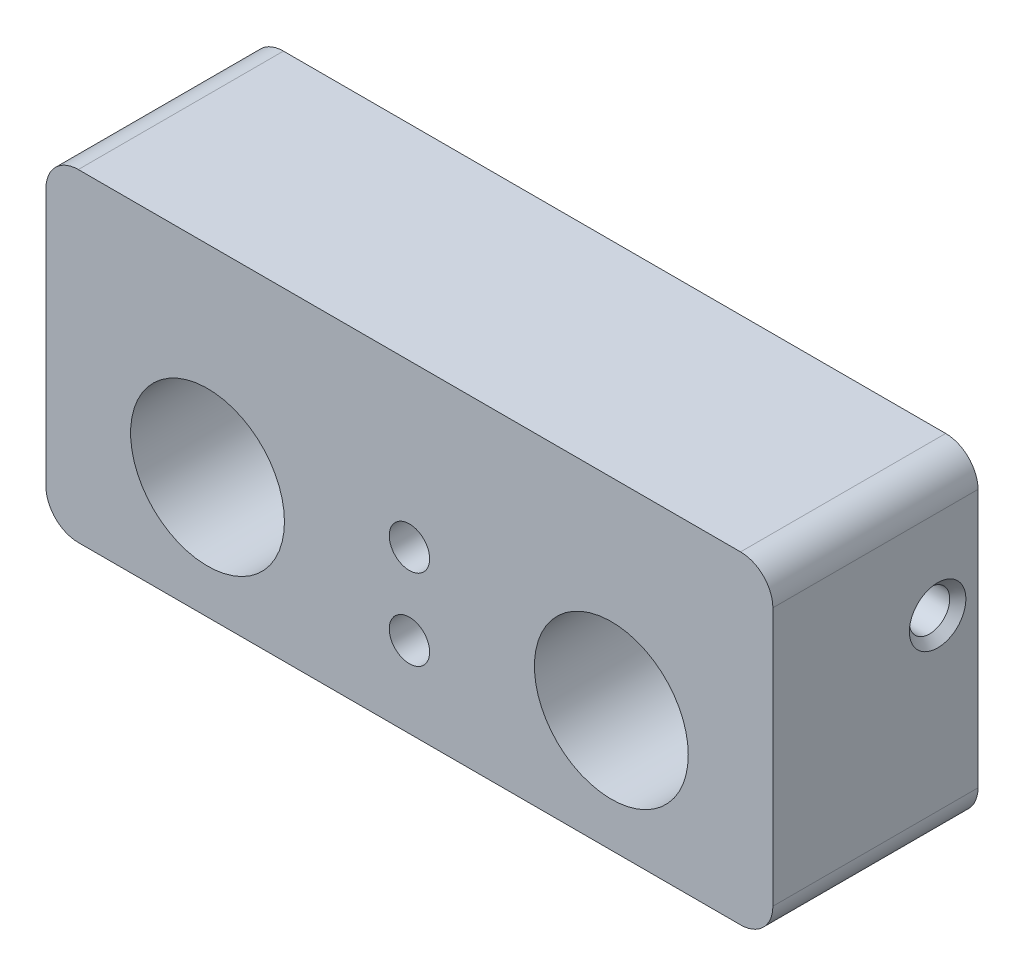
ISO-10303-21;
HEADER;
FILE_DESCRIPTION(('STEP AP214'),'2;1');
FILE_NAME('part.step','',(''),(''),'','','');
FILE_SCHEMA(('AUTOMOTIVE_DESIGN { 1 0 10303 214 1 1 1 1 }'));
ENDSEC;
DATA;
#1=APPLICATION_CONTEXT('core data for automotive mechanical design processes');
#2=APPLICATION_PROTOCOL_DEFINITION('international standard','automotive_design',2000,#1);
#3=PRODUCT_CONTEXT('',#1,'mechanical');
#4=PRODUCT('Part','Part','',(#3));
#5=PRODUCT_RELATED_PRODUCT_CATEGORY('part','',(#4));
#6=PRODUCT_DEFINITION_FORMATION('','',#4);
#7=PRODUCT_DEFINITION_CONTEXT('part definition',#1,'design');
#8=PRODUCT_DEFINITION('design','',#6,#7);
#9=PRODUCT_DEFINITION_SHAPE('','',#8);
#10=(LENGTH_UNIT() NAMED_UNIT(*) SI_UNIT(.MILLI.,.METRE.));
#11=(NAMED_UNIT(*) PLANE_ANGLE_UNIT() SI_UNIT($,.RADIAN.));
#12=(NAMED_UNIT(*) SI_UNIT($,.STERADIAN.) SOLID_ANGLE_UNIT());
#13=UNCERTAINTY_MEASURE_WITH_UNIT(LENGTH_MEASURE(1.E-05),#10,'distance_accuracy_value','');
#14=(GEOMETRIC_REPRESENTATION_CONTEXT(3) GLOBAL_UNCERTAINTY_ASSIGNED_CONTEXT((#13)) GLOBAL_UNIT_ASSIGNED_CONTEXT((#10,
#11,#12)) REPRESENTATION_CONTEXT('',''));
#15=CARTESIAN_POINT('',(0.,0.,0.));
#16=DIRECTION('',(0.,0.,1.));
#17=DIRECTION('',(1.,0.,0.));
#18=AXIS2_PLACEMENT_3D('',#15,#16,#17);
#19=CARTESIAN_POINT('',(0.,0.,12.7));
#20=DIRECTION('',(0.,0.,1.));
#21=DIRECTION('',(1.,0.,0.));
#22=AXIS2_PLACEMENT_3D('',#19,#20,#21);
#23=PLANE('',#22);
#24=CARTESIAN_POINT('',(5.81896551724137,-6.28448275862069,12.7));
#25=DIRECTION('',(0.,0.,1.));
#26=DIRECTION('',(1.,0.,0.));
#27=AXIS2_PLACEMENT_3D('',#24,#25,#26);
#28=CIRCLE('',#27,1.25);
#29=CARTESIAN_POINT('',(7.06896551724137,-6.28448275862069,12.7));
#30=VERTEX_POINT('',#29);
#31=EDGE_CURVE('E126',#30,#30,#28,.T.);
#32=ORIENTED_EDGE('',*,*,#31,.F.);
#33=EDGE_LOOP('',(#32));
#34=FACE_BOUND('',#33,.T.);
#35=CARTESIAN_POINT('',(5.81896551724137,-11.2844827586207,12.7));
#36=DIRECTION('',(0.,0.,1.));
#37=DIRECTION('',(1.,0.,0.));
#38=AXIS2_PLACEMENT_3D('',#35,#36,#37);
#39=CIRCLE('',#38,1.25);
#40=CARTESIAN_POINT('',(7.06896551724137,-11.2844827586207,12.7));
#41=VERTEX_POINT('',#40);
#42=EDGE_CURVE('E134',#41,#41,#39,.T.);
#43=ORIENTED_EDGE('',*,*,#42,.F.);
#44=EDGE_LOOP('',(#43));
#45=FACE_BOUND('',#44,.T.);
#46=CARTESIAN_POINT('',(-6.68103448275862,-8.78448275862069,12.7));
#47=DIRECTION('',(0.,0.,1.));
#48=DIRECTION('',(1.,0.,0.));
#49=AXIS2_PLACEMENT_3D('',#46,#47,#48);
#50=CIRCLE('',#49,4.7625);
#51=CARTESIAN_POINT('',(-1.91853448275862,-8.78448275862069,12.7));
#52=VERTEX_POINT('',#51);
#53=EDGE_CURVE('E147',#52,#52,#50,.T.);
#54=ORIENTED_EDGE('',*,*,#53,.F.);
#55=EDGE_LOOP('',(#54));
#56=FACE_BOUND('',#55,.T.);
#57=DIRECTION('',(1.,0.,0.));
#58=VECTOR('',#57,1.);
#59=CARTESIAN_POINT('',(-16.6810344827586,-16.2844827586207,12.7));
#60=LINE('',#59,#58);
#61=CARTESIAN_POINT('',(-14.6810344827586,-16.2844827586207,12.7));
#62=VERTEX_POINT('',#61);
#63=CARTESIAN_POINT('',(26.3189655172414,-16.2844827586207,12.7));
#64=VERTEX_POINT('',#63);
#65=EDGE_CURVE('E156',#62,#64,#60,.T.);
#66=ORIENTED_EDGE('',*,*,#65,.T.);
#67=CARTESIAN_POINT('',(26.3189655172414,-14.2844827586207,12.7));
#68=DIRECTION('',(0.,0.,1.));
#69=DIRECTION('',(1.,0.,0.));
#70=AXIS2_PLACEMENT_3D('',#67,#68,#69);
#71=CIRCLE('',#70,2.);
#72=CARTESIAN_POINT('',(28.3189655172414,-14.2844827586207,12.7));
#73=VERTEX_POINT('',#72);
#74=EDGE_CURVE('E196',#64,#73,#71,.T.);
#75=ORIENTED_EDGE('',*,*,#74,.T.);
#76=DIRECTION('',(0.,1.,0.));
#77=VECTOR('',#76,1.);
#78=CARTESIAN_POINT('',(28.3189655172414,3.71551724137931,12.7));
#79=LINE('',#78,#77);
#80=CARTESIAN_POINT('',(28.3189655172414,1.71551724137931,12.7));
#81=VERTEX_POINT('',#80);
#82=EDGE_CURVE('E160',#73,#81,#79,.T.);
#83=ORIENTED_EDGE('',*,*,#82,.T.);
#84=CARTESIAN_POINT('',(26.3189655172414,1.71551724137931,12.7));
#85=DIRECTION('',(0.,0.,1.));
#86=DIRECTION('',(1.,0.,0.));
#87=AXIS2_PLACEMENT_3D('',#84,#85,#86);
#88=CIRCLE('',#87,2.);
#89=CARTESIAN_POINT('',(26.3189655172414,3.71551724137931,12.7));
#90=VERTEX_POINT('',#89);
#91=EDGE_CURVE('E58',#81,#90,#88,.T.);
#92=ORIENTED_EDGE('',*,*,#91,.T.);
#93=DIRECTION('',(-1.,0.,0.));
#94=VECTOR('',#93,1.);
#95=CARTESIAN_POINT('',(-16.6810344827586,3.71551724137931,12.7));
#96=LINE('',#95,#94);
#97=CARTESIAN_POINT('',(-14.6810344827586,3.71551724137931,12.7));
#98=VERTEX_POINT('',#97);
#99=EDGE_CURVE('E162',#90,#98,#96,.T.);
#100=ORIENTED_EDGE('',*,*,#99,.T.);
#101=CARTESIAN_POINT('',(-14.6810344827586,1.71551724137931,12.7));
#102=DIRECTION('',(0.,0.,1.));
#103=DIRECTION('',(1.,0.,0.));
#104=AXIS2_PLACEMENT_3D('',#101,#102,#103);
#105=CIRCLE('',#104,2.);
#106=CARTESIAN_POINT('',(-16.6810344827586,1.71551724137931,12.7));
#107=VERTEX_POINT('',#106);
#108=EDGE_CURVE('E193',#98,#107,#105,.T.);
#109=ORIENTED_EDGE('',*,*,#108,.T.);
#110=DIRECTION('',(0.,-1.,0.));
#111=VECTOR('',#110,1.);
#112=CARTESIAN_POINT('',(-16.6810344827586,3.71551724137931,12.7));
#113=LINE('',#112,#111);
#114=CARTESIAN_POINT('',(-16.6810344827586,-14.2844827586207,12.7));
#115=VERTEX_POINT('',#114);
#116=EDGE_CURVE('E153',#107,#115,#113,.T.);
#117=ORIENTED_EDGE('',*,*,#116,.T.);
#118=CARTESIAN_POINT('',(-14.6810344827586,-14.2844827586207,12.7));
#119=DIRECTION('',(0.,0.,1.));
#120=DIRECTION('',(1.,0.,0.));
#121=AXIS2_PLACEMENT_3D('',#118,#119,#120);
#122=CIRCLE('',#121,2.);
#123=EDGE_CURVE('E191',#115,#62,#122,.T.);
#124=ORIENTED_EDGE('',*,*,#123,.T.);
#125=EDGE_LOOP('',(#66,#75,#83,#92,#100,#109,#117,#124));
#126=FACE_BOUND('',#125,.T.);
#127=CARTESIAN_POINT('',(18.3189655172414,-8.78448275862069,12.7));
#128=DIRECTION('',(0.,0.,1.));
#129=DIRECTION('',(1.,0.,0.));
#130=AXIS2_PLACEMENT_3D('',#127,#128,#129);
#131=CIRCLE('',#130,4.7625);
#132=CARTESIAN_POINT('',(23.0814655172414,-8.78448275862069,12.7));
#133=VERTEX_POINT('',#132);
#134=EDGE_CURVE('E141',#133,#133,#131,.T.);
#135=ORIENTED_EDGE('',*,*,#134,.F.);
#136=EDGE_LOOP('',(#135));
#137=FACE_BOUND('',#136,.T.);
#138=ADVANCED_FACE('F35',(#34,#45,#56,#126,#137),#23,.T.);
#139=CARTESIAN_POINT('',(0.,0.,0.));
#140=DIRECTION('',(0.,0.,1.));
#141=DIRECTION('',(1.,0.,0.));
#142=AXIS2_PLACEMENT_3D('',#139,#140,#141);
#143=PLANE('',#142);
#144=DIRECTION('',(0.,1.,0.));
#145=VECTOR('',#144,1.);
#146=CARTESIAN_POINT('',(28.3189655172414,3.71551724137931,0.));
#147=LINE('',#146,#145);
#148=CARTESIAN_POINT('',(28.3189655172414,-14.2844827586207,0.));
#149=VERTEX_POINT('',#148);
#150=CARTESIAN_POINT('',(28.3189655172414,1.71551724137931,0.));
#151=VERTEX_POINT('',#150);
#152=EDGE_CURVE('E170',#149,#151,#147,.T.);
#153=ORIENTED_EDGE('',*,*,#152,.F.);
#154=CARTESIAN_POINT('',(26.3189655172414,-14.2844827586207,0.));
#155=DIRECTION('',(0.,0.,1.));
#156=DIRECTION('',(1.,0.,0.));
#157=AXIS2_PLACEMENT_3D('',#154,#155,#156);
#158=CIRCLE('',#157,2.);
#159=CARTESIAN_POINT('',(26.3189655172414,-16.2844827586207,0.));
#160=VERTEX_POINT('',#159);
#161=EDGE_CURVE('E184',#149,#160,#158,.F.);
#162=ORIENTED_EDGE('',*,*,#161,.T.);
#163=DIRECTION('',(1.,0.,0.));
#164=VECTOR('',#163,1.);
#165=CARTESIAN_POINT('',(-16.6810344827586,-16.2844827586207,0.));
#166=LINE('',#165,#164);
#167=CARTESIAN_POINT('',(-14.6810344827586,-16.2844827586207,0.));
#168=VERTEX_POINT('',#167);
#169=EDGE_CURVE('E167',#168,#160,#166,.T.);
#170=ORIENTED_EDGE('',*,*,#169,.F.);
#171=CARTESIAN_POINT('',(-14.6810344827586,-14.2844827586207,0.));
#172=DIRECTION('',(0.,0.,1.));
#173=DIRECTION('',(1.,0.,0.));
#174=AXIS2_PLACEMENT_3D('',#171,#172,#173);
#175=CIRCLE('',#174,2.);
#176=CARTESIAN_POINT('',(-16.6810344827586,-14.2844827586207,0.));
#177=VERTEX_POINT('',#176);
#178=EDGE_CURVE('E178',#168,#177,#175,.F.);
#179=ORIENTED_EDGE('',*,*,#178,.T.);
#180=DIRECTION('',(0.,-1.,0.));
#181=VECTOR('',#180,1.);
#182=CARTESIAN_POINT('',(-16.6810344827586,3.71551724137931,0.));
#183=LINE('',#182,#181);
#184=CARTESIAN_POINT('',(-16.6810344827586,1.71551724137931,0.));
#185=VERTEX_POINT('',#184);
#186=EDGE_CURVE('E150',#185,#177,#183,.T.);
#187=ORIENTED_EDGE('',*,*,#186,.F.);
#188=CARTESIAN_POINT('',(-14.6810344827586,1.71551724137931,0.));
#189=DIRECTION('',(0.,0.,1.));
#190=DIRECTION('',(1.,0.,0.));
#191=AXIS2_PLACEMENT_3D('',#188,#189,#190);
#192=CIRCLE('',#191,2.);
#193=CARTESIAN_POINT('',(-14.6810344827586,3.71551724137931,0.));
#194=VERTEX_POINT('',#193);
#195=EDGE_CURVE('E180',#185,#194,#192,.F.);
#196=ORIENTED_EDGE('',*,*,#195,.T.);
#197=DIRECTION('',(-1.,0.,0.));
#198=VECTOR('',#197,1.);
#199=CARTESIAN_POINT('',(-16.6810344827586,3.71551724137931,0.));
#200=LINE('',#199,#198);
#201=CARTESIAN_POINT('',(26.3189655172414,3.71551724137931,0.));
#202=VERTEX_POINT('',#201);
#203=EDGE_CURVE('E157',#202,#194,#200,.T.);
#204=ORIENTED_EDGE('',*,*,#203,.F.);
#205=CARTESIAN_POINT('',(26.3189655172414,1.71551724137931,0.));
#206=DIRECTION('',(0.,0.,1.));
#207=DIRECTION('',(1.,0.,0.));
#208=AXIS2_PLACEMENT_3D('',#205,#206,#207);
#209=CIRCLE('',#208,2.);
#210=EDGE_CURVE('E182',#202,#151,#209,.F.);
#211=ORIENTED_EDGE('',*,*,#210,.T.);
#212=EDGE_LOOP('',(#153,#162,#170,#179,#187,#196,#204,#211));
#213=FACE_BOUND('',#212,.T.);
#214=CARTESIAN_POINT('',(-6.68103448275862,-8.78448275862069,0.));
#215=DIRECTION('',(0.,0.,1.));
#216=DIRECTION('',(1.,0.,0.));
#217=AXIS2_PLACEMENT_3D('',#214,#215,#216);
#218=CIRCLE('',#217,4.7625);
#219=CARTESIAN_POINT('',(-1.91853448275862,-8.78448275862069,0.));
#220=VERTEX_POINT('',#219);
#221=EDGE_CURVE('E144',#220,#220,#218,.T.);
#222=ORIENTED_EDGE('',*,*,#221,.T.);
#223=EDGE_LOOP('',(#222));
#224=FACE_BOUND('',#223,.T.);
#225=CARTESIAN_POINT('',(18.3189655172414,-8.78448275862069,0.));
#226=DIRECTION('',(0.,0.,1.));
#227=DIRECTION('',(1.,0.,0.));
#228=AXIS2_PLACEMENT_3D('',#225,#226,#227);
#229=CIRCLE('',#228,4.7625);
#230=CARTESIAN_POINT('',(23.0814655172414,-8.78448275862069,0.));
#231=VERTEX_POINT('',#230);
#232=EDGE_CURVE('E140',#231,#231,#229,.T.);
#233=ORIENTED_EDGE('',*,*,#232,.T.);
#234=EDGE_LOOP('',(#233));
#235=FACE_BOUND('',#234,.T.);
#236=ADVANCED_FACE('F226',(#213,#224,#235),#143,.F.);
#237=CARTESIAN_POINT('',(-16.6810344827586,3.71551724137931,12.7));
#238=DIRECTION('',(1.,0.,0.));
#239=DIRECTION('',(0.,1.,0.));
#240=AXIS2_PLACEMENT_3D('',#237,#238,#239);
#241=PLANE('',#240);
#242=CARTESIAN_POINT('',(-16.6810344827586,-3.78448275862069,2.5));
#243=DIRECTION('',(1.,0.,0.));
#244=DIRECTION('',(0.,1.,0.));
#245=AXIS2_PLACEMENT_3D('',#242,#243,#244);
#246=CIRCLE('',#245,1.74999999999998);
#247=CARTESIAN_POINT('',(-16.6810344827586,-2.03448275862071,2.5));
#248=VERTEX_POINT('',#247);
#249=EDGE_CURVE('E11',#248,#248,#246,.T.);
#250=ORIENTED_EDGE('',*,*,#249,.T.);
#251=EDGE_LOOP('',(#250));
#252=FACE_BOUND('',#251,.T.);
#253=ORIENTED_EDGE('',*,*,#116,.F.);
#254=DIRECTION('',(0.,0.,-1.));
#255=VECTOR('',#254,1.);
#256=CARTESIAN_POINT('',(-16.6810344827586,1.71551724137931,12.7));
#257=LINE('',#256,#255);
#258=EDGE_CURVE('E204',#107,#185,#257,.T.);
#259=ORIENTED_EDGE('',*,*,#258,.T.);
#260=ORIENTED_EDGE('',*,*,#186,.T.);
#261=DIRECTION('',(0.,0.,-1.));
#262=VECTOR('',#261,1.);
#263=CARTESIAN_POINT('',(-16.6810344827586,-14.2844827586207,12.7));
#264=LINE('',#263,#262);
#265=EDGE_CURVE('E202',#177,#115,#264,.F.);
#266=ORIENTED_EDGE('',*,*,#265,.T.);
#267=EDGE_LOOP('',(#253,#259,#260,#266));
#268=FACE_BOUND('',#267,.T.);
#269=ADVANCED_FACE('F232',(#252,#268),#241,.F.);
#270=CARTESIAN_POINT('',(-16.6810344827586,-16.2844827586207,12.7));
#271=DIRECTION('',(0.,1.,0.));
#272=DIRECTION('',(0.,0.,1.));
#273=AXIS2_PLACEMENT_3D('',#270,#271,#272);
#274=PLANE('',#273);
#275=ORIENTED_EDGE('',*,*,#169,.T.);
#276=DIRECTION('',(0.,0.,-1.));
#277=VECTOR('',#276,1.);
#278=CARTESIAN_POINT('',(26.3189655172414,-16.2844827586207,12.7));
#279=LINE('',#278,#277);
#280=EDGE_CURVE('E189',#160,#64,#279,.F.);
#281=ORIENTED_EDGE('',*,*,#280,.T.);
#282=ORIENTED_EDGE('',*,*,#65,.F.);
#283=DIRECTION('',(0.,0.,-1.));
#284=VECTOR('',#283,1.);
#285=CARTESIAN_POINT('',(-14.6810344827586,-16.2844827586207,12.7));
#286=LINE('',#285,#284);
#287=EDGE_CURVE('E186',#62,#168,#286,.T.);
#288=ORIENTED_EDGE('',*,*,#287,.T.);
#289=EDGE_LOOP('',(#275,#281,#282,#288));
#290=FACE_BOUND('',#289,.T.);
#291=ADVANCED_FACE('F247',(#290),#274,.F.);
#292=CARTESIAN_POINT('',(28.3189655172414,3.71551724137931,12.7));
#293=DIRECTION('',(-1.,0.,0.));
#294=DIRECTION('',(0.,-1.,0.));
#295=AXIS2_PLACEMENT_3D('',#292,#293,#294);
#296=PLANE('',#295);
#297=CARTESIAN_POINT('',(28.3189655172414,-3.78448275862068,2.5));
#298=DIRECTION('',(-1.,0.,0.));
#299=DIRECTION('',(0.,-1.,0.));
#300=AXIS2_PLACEMENT_3D('',#297,#298,#299);
#301=CIRCLE('',#300,1.75);
#302=CARTESIAN_POINT('',(28.3189655172414,-5.53448275862068,2.5));
#303=VERTEX_POINT('',#302);
#304=EDGE_CURVE('E210',#303,#303,#301,.T.);
#305=ORIENTED_EDGE('',*,*,#304,.T.);
#306=EDGE_LOOP('',(#305));
#307=FACE_BOUND('',#306,.T.);
#308=ORIENTED_EDGE('',*,*,#82,.F.);
#309=DIRECTION('',(0.,0.,-1.));
#310=VECTOR('',#309,1.);
#311=CARTESIAN_POINT('',(28.3189655172414,-14.2844827586207,12.7));
#312=LINE('',#311,#310);
#313=EDGE_CURVE('E175',#73,#149,#312,.T.);
#314=ORIENTED_EDGE('',*,*,#313,.T.);
#315=ORIENTED_EDGE('',*,*,#152,.T.);
#316=DIRECTION('',(0.,0.,-1.));
#317=VECTOR('',#316,1.);
#318=CARTESIAN_POINT('',(28.3189655172414,1.71551724137931,12.7));
#319=LINE('',#318,#317);
#320=EDGE_CURVE('E164',#151,#81,#319,.F.);
#321=ORIENTED_EDGE('',*,*,#320,.T.);
#322=EDGE_LOOP('',(#308,#314,#315,#321));
#323=FACE_BOUND('',#322,.T.);
#324=ADVANCED_FACE('F244',(#307,#323),#296,.F.);
#325=CARTESIAN_POINT('',(-16.6810344827586,3.71551724137931,12.7));
#326=DIRECTION('',(0.,-1.,0.));
#327=DIRECTION('',(0.,0.,-1.));
#328=AXIS2_PLACEMENT_3D('',#325,#326,#327);
#329=PLANE('',#328);
#330=ORIENTED_EDGE('',*,*,#99,.F.);
#331=DIRECTION('',(0.,0.,-1.));
#332=VECTOR('',#331,1.);
#333=CARTESIAN_POINT('',(26.3189655172414,3.71551724137931,12.7));
#334=LINE('',#333,#332);
#335=EDGE_CURVE('E199',#90,#202,#334,.T.);
#336=ORIENTED_EDGE('',*,*,#335,.T.);
#337=ORIENTED_EDGE('',*,*,#203,.T.);
#338=DIRECTION('',(0.,0.,-1.));
#339=VECTOR('',#338,1.);
#340=CARTESIAN_POINT('',(-14.6810344827586,3.71551724137931,12.7));
#341=LINE('',#340,#339);
#342=EDGE_CURVE('E51',#194,#98,#341,.F.);
#343=ORIENTED_EDGE('',*,*,#342,.T.);
#344=EDGE_LOOP('',(#330,#336,#337,#343));
#345=FACE_BOUND('',#344,.T.);
#346=ADVANCED_FACE('F241',(#345),#329,.F.);
#347=CARTESIAN_POINT('',(-6.68103448275862,-8.78448275862069,12.7));
#348=DIRECTION('',(0.,0.,-1.));
#349=DIRECTION('',(-1.,0.,0.));
#350=AXIS2_PLACEMENT_3D('',#347,#348,#349);
#351=CYLINDRICAL_SURFACE('',#350,4.7625);
#352=ORIENTED_EDGE('',*,*,#53,.T.);
#353=EDGE_LOOP('',(#352));
#354=FACE_BOUND('',#353,.T.);
#355=ORIENTED_EDGE('',*,*,#221,.F.);
#356=EDGE_LOOP('',(#355));
#357=FACE_BOUND('',#356,.T.);
#358=ADVANCED_FACE('F238',(#354,#357),#351,.F.);
#359=CARTESIAN_POINT('',(18.3189655172414,-8.78448275862069,12.7));
#360=DIRECTION('',(0.,0.,-1.));
#361=DIRECTION('',(-1.,0.,0.));
#362=AXIS2_PLACEMENT_3D('',#359,#360,#361);
#363=CYLINDRICAL_SURFACE('',#362,4.7625);
#364=ORIENTED_EDGE('',*,*,#134,.T.);
#365=EDGE_LOOP('',(#364));
#366=FACE_BOUND('',#365,.T.);
#367=ORIENTED_EDGE('',*,*,#232,.F.);
#368=EDGE_LOOP('',(#367));
#369=FACE_BOUND('',#368,.T.);
#370=ADVANCED_FACE('F307',(#366,#369),#363,.F.);
#371=CARTESIAN_POINT('',(5.81896551724137,-11.2844827586207,2.7));
#372=DIRECTION('',(0.,0.,1.));
#373=DIRECTION('',(1.,0.,0.));
#374=AXIS2_PLACEMENT_3D('',#371,#372,#373);
#375=CONICAL_SURFACE('',#374,1.25,1.02974425867665);
#376=CARTESIAN_POINT('',(5.81896551724137,-11.2844827586207,1.94892422621555));
#377=VERTEX_POINT('',#376);
#378=VERTEX_LOOP('',#377);
#379=FACE_BOUND('',#378,.T.);
#380=CARTESIAN_POINT('',(5.81896551724137,-11.2844827586207,2.7));
#381=DIRECTION('',(0.,0.,1.));
#382=DIRECTION('',(1.,0.,0.));
#383=AXIS2_PLACEMENT_3D('',#380,#381,#382);
#384=CIRCLE('',#383,1.25);
#385=CARTESIAN_POINT('',(7.06896551724137,-11.2844827586207,2.7));
#386=VERTEX_POINT('',#385);
#387=EDGE_CURVE('E137',#386,#386,#384,.T.);
#388=ORIENTED_EDGE('',*,*,#387,.T.);
#389=EDGE_LOOP('',(#388));
#390=FACE_BOUND('',#389,.T.);
#391=ADVANCED_FACE('F309',(#379,#390),#375,.F.);
#392=CARTESIAN_POINT('',(5.81896551724137,-11.2844827586207,12.7));
#393=DIRECTION('',(0.,0.,1.));
#394=DIRECTION('',(1.,0.,0.));
#395=AXIS2_PLACEMENT_3D('',#392,#393,#394);
#396=CYLINDRICAL_SURFACE('',#395,1.25);
#397=ORIENTED_EDGE('',*,*,#387,.F.);
#398=EDGE_LOOP('',(#397));
#399=FACE_BOUND('',#398,.T.);
#400=ORIENTED_EDGE('',*,*,#42,.T.);
#401=EDGE_LOOP('',(#400));
#402=FACE_BOUND('',#401,.T.);
#403=ADVANCED_FACE('F315',(#399,#402),#396,.F.);
#404=CARTESIAN_POINT('',(5.81896551724137,-6.28448275862069,2.7));
#405=DIRECTION('',(0.,0.,1.));
#406=DIRECTION('',(1.,0.,0.));
#407=AXIS2_PLACEMENT_3D('',#404,#405,#406);
#408=CONICAL_SURFACE('',#407,1.25,1.02974425867665);
#409=CARTESIAN_POINT('',(5.81896551724137,-6.28448275862069,1.94892422621555));
#410=VERTEX_POINT('',#409);
#411=VERTEX_LOOP('',#410);
#412=FACE_BOUND('',#411,.T.);
#413=CARTESIAN_POINT('',(5.81896551724137,-6.28448275862069,2.7));
#414=DIRECTION('',(0.,0.,1.));
#415=DIRECTION('',(1.,0.,0.));
#416=AXIS2_PLACEMENT_3D('',#413,#414,#415);
#417=CIRCLE('',#416,1.25);
#418=CARTESIAN_POINT('',(7.06896551724137,-6.28448275862069,2.7));
#419=VERTEX_POINT('',#418);
#420=EDGE_CURVE('E131',#419,#419,#417,.T.);
#421=ORIENTED_EDGE('',*,*,#420,.T.);
#422=EDGE_LOOP('',(#421));
#423=FACE_BOUND('',#422,.T.);
#424=ADVANCED_FACE('F322',(#412,#423),#408,.F.);
#425=CARTESIAN_POINT('',(5.81896551724137,-6.28448275862069,12.7));
#426=DIRECTION('',(0.,0.,1.));
#427=DIRECTION('',(1.,0.,0.));
#428=AXIS2_PLACEMENT_3D('',#425,#426,#427);
#429=CYLINDRICAL_SURFACE('',#428,1.25);
#430=ORIENTED_EDGE('',*,*,#420,.F.);
#431=EDGE_LOOP('',(#430));
#432=FACE_BOUND('',#431,.T.);
#433=ORIENTED_EDGE('',*,*,#31,.T.);
#434=EDGE_LOOP('',(#433));
#435=FACE_BOUND('',#434,.T.);
#436=ADVANCED_FACE('F259',(#432,#435),#429,.F.);
#437=CARTESIAN_POINT('',(26.3189655172414,-14.2844827586207,12.7));
#438=DIRECTION('',(0.,0.,-1.));
#439=DIRECTION('',(-1.,0.,0.));
#440=AXIS2_PLACEMENT_3D('',#437,#438,#439);
#441=CYLINDRICAL_SURFACE('',#440,2.);
#442=ORIENTED_EDGE('',*,*,#74,.F.);
#443=ORIENTED_EDGE('',*,*,#280,.F.);
#444=ORIENTED_EDGE('',*,*,#161,.F.);
#445=ORIENTED_EDGE('',*,*,#313,.F.);
#446=EDGE_LOOP('',(#442,#443,#444,#445));
#447=FACE_BOUND('',#446,.T.);
#448=ADVANCED_FACE('F255',(#447),#441,.T.);
#449=CARTESIAN_POINT('',(26.3189655172414,1.71551724137931,12.7));
#450=DIRECTION('',(0.,0.,-1.));
#451=DIRECTION('',(-1.,0.,0.));
#452=AXIS2_PLACEMENT_3D('',#449,#450,#451);
#453=CYLINDRICAL_SURFACE('',#452,2.);
#454=ORIENTED_EDGE('',*,*,#91,.F.);
#455=ORIENTED_EDGE('',*,*,#320,.F.);
#456=ORIENTED_EDGE('',*,*,#210,.F.);
#457=ORIENTED_EDGE('',*,*,#335,.F.);
#458=EDGE_LOOP('',(#454,#455,#456,#457));
#459=FACE_BOUND('',#458,.T.);
#460=ADVANCED_FACE('F258',(#459),#453,.T.);
#461=CARTESIAN_POINT('',(-14.6810344827586,1.71551724137931,12.7));
#462=DIRECTION('',(0.,0.,-1.));
#463=DIRECTION('',(-1.,0.,0.));
#464=AXIS2_PLACEMENT_3D('',#461,#462,#463);
#465=CYLINDRICAL_SURFACE('',#464,2.);
#466=ORIENTED_EDGE('',*,*,#108,.F.);
#467=ORIENTED_EDGE('',*,*,#342,.F.);
#468=ORIENTED_EDGE('',*,*,#195,.F.);
#469=ORIENTED_EDGE('',*,*,#258,.F.);
#470=EDGE_LOOP('',(#466,#467,#468,#469));
#471=FACE_BOUND('',#470,.T.);
#472=ADVANCED_FACE('F263',(#471),#465,.T.);
#473=CARTESIAN_POINT('',(-14.6810344827586,-14.2844827586207,12.7));
#474=DIRECTION('',(0.,0.,-1.));
#475=DIRECTION('',(-1.,0.,0.));
#476=AXIS2_PLACEMENT_3D('',#473,#474,#475);
#477=CYLINDRICAL_SURFACE('',#476,2.);
#478=ORIENTED_EDGE('',*,*,#123,.F.);
#479=ORIENTED_EDGE('',*,*,#265,.F.);
#480=ORIENTED_EDGE('',*,*,#178,.F.);
#481=ORIENTED_EDGE('',*,*,#287,.F.);
#482=EDGE_LOOP('',(#478,#479,#480,#481));
#483=FACE_BOUND('',#482,.T.);
#484=ADVANCED_FACE('F267',(#483),#477,.T.);
#485=CARTESIAN_POINT('',(-11.6810344827586,-3.78448275862069,2.5));
#486=DIRECTION('',(-1.,0.,0.));
#487=DIRECTION('',(0.,0.,1.));
#488=AXIS2_PLACEMENT_3D('',#485,#486,#487);
#489=CONICAL_SURFACE('',#488,1.24999999999999,1.02974425867665);
#490=CARTESIAN_POINT('',(-10.9299587089742,-3.78448275862069,2.5));
#491=VERTEX_POINT('',#490);
#492=VERTEX_LOOP('',#491);
#493=FACE_BOUND('',#492,.T.);
#494=CARTESIAN_POINT('',(-11.6810344827586,-3.78448275862069,2.5));
#495=DIRECTION('',(-1.,0.,0.));
#496=DIRECTION('',(0.,0.,1.));
#497=AXIS2_PLACEMENT_3D('',#494,#495,#496);
#498=CIRCLE('',#497,1.24999999999999);
#499=CARTESIAN_POINT('',(-11.6810344827586,-3.78448275862069,3.74999999999999));
#500=VERTEX_POINT('',#499);
#501=EDGE_CURVE('E123',#500,#500,#498,.T.);
#502=ORIENTED_EDGE('',*,*,#501,.T.);
#503=EDGE_LOOP('',(#502));
#504=FACE_BOUND('',#503,.T.);
#505=ADVANCED_FACE('F270',(#493,#504),#489,.F.);
#506=CARTESIAN_POINT('',(-16.6810344827586,-3.78448275862069,2.5));
#507=DIRECTION('',(-1.,0.,0.));
#508=DIRECTION('',(0.,0.,1.));
#509=AXIS2_PLACEMENT_3D('',#506,#507,#508);
#510=CYLINDRICAL_SURFACE('',#509,1.24999999999999);
#511=CARTESIAN_POINT('',(-16.1810344827586,-3.78448275862069,2.5));
#512=DIRECTION('',(1.,0.,0.));
#513=DIRECTION('',(0.,0.,-1.));
#514=AXIS2_PLACEMENT_3D('',#511,#512,#513);
#515=CIRCLE('',#514,1.24999999999999);
#516=CARTESIAN_POINT('',(-16.1810344827586,-3.78448275862069,1.25000000000001));
#517=VERTEX_POINT('',#516);
#518=EDGE_CURVE('E44',#517,#517,#515,.F.);
#519=ORIENTED_EDGE('',*,*,#518,.T.);
#520=EDGE_LOOP('',(#519));
#521=FACE_BOUND('',#520,.T.);
#522=ORIENTED_EDGE('',*,*,#501,.F.);
#523=EDGE_LOOP('',(#522));
#524=FACE_BOUND('',#523,.T.);
#525=ADVANCED_FACE('F117',(#521,#524),#510,.F.);
#526=CARTESIAN_POINT('',(23.3189655172414,-3.78448275862068,2.5));
#527=DIRECTION('',(1.,0.,0.));
#528=DIRECTION('',(0.,0.,-1.));
#529=AXIS2_PLACEMENT_3D('',#526,#527,#528);
#530=CONICAL_SURFACE('',#529,1.24999999999999,1.02974425867665);
#531=CARTESIAN_POINT('',(22.5678897434569,-3.78448275862068,2.5));
#532=VERTEX_POINT('',#531);
#533=VERTEX_LOOP('',#532);
#534=FACE_BOUND('',#533,.T.);
#535=CARTESIAN_POINT('',(23.3189655172414,-3.78448275862068,2.5));
#536=DIRECTION('',(1.,0.,0.));
#537=DIRECTION('',(0.,0.,-1.));
#538=AXIS2_PLACEMENT_3D('',#535,#536,#537);
#539=CIRCLE('',#538,1.24999999999999);
#540=CARTESIAN_POINT('',(23.3189655172414,-3.78448275862068,1.25000000000001));
#541=VERTEX_POINT('',#540);
#542=EDGE_CURVE('E121',#541,#541,#539,.T.);
#543=ORIENTED_EDGE('',*,*,#542,.T.);
#544=EDGE_LOOP('',(#543));
#545=FACE_BOUND('',#544,.T.);
#546=ADVANCED_FACE('F113',(#534,#545),#530,.F.);
#547=CARTESIAN_POINT('',(28.3189655172414,-3.78448275862068,2.5));
#548=DIRECTION('',(1.,0.,0.));
#549=DIRECTION('',(0.,0.,-1.));
#550=AXIS2_PLACEMENT_3D('',#547,#548,#549);
#551=CYLINDRICAL_SURFACE('',#550,1.24999999999999);
#552=CARTESIAN_POINT('',(27.8189655172414,-3.78448275862068,2.5));
#553=DIRECTION('',(-1.,0.,0.));
#554=DIRECTION('',(0.,0.,1.));
#555=AXIS2_PLACEMENT_3D('',#552,#553,#554);
#556=CIRCLE('',#555,1.24999999999999);
#557=CARTESIAN_POINT('',(27.8189655172414,-3.78448275862068,3.74999999999999));
#558=VERTEX_POINT('',#557);
#559=EDGE_CURVE('E207',#558,#558,#556,.F.);
#560=ORIENTED_EDGE('',*,*,#559,.T.);
#561=EDGE_LOOP('',(#560));
#562=FACE_BOUND('',#561,.T.);
#563=ORIENTED_EDGE('',*,*,#542,.F.);
#564=EDGE_LOOP('',(#563));
#565=FACE_BOUND('',#564,.T.);
#566=ADVANCED_FACE('F116',(#562,#565),#551,.F.);
#567=CARTESIAN_POINT('',(27.8189655172414,-3.78448275862068,2.5));
#568=DIRECTION('',(1.,0.,0.));
#569=DIRECTION('',(0.,0.,-1.));
#570=AXIS2_PLACEMENT_3D('',#567,#568,#569);
#571=CONICAL_SURFACE('',#570,1.24999999999999,0.785398163397455);
#572=ORIENTED_EDGE('',*,*,#304,.F.);
#573=EDGE_LOOP('',(#572));
#574=FACE_BOUND('',#573,.T.);
#575=ORIENTED_EDGE('',*,*,#559,.F.);
#576=EDGE_LOOP('',(#575));
#577=FACE_BOUND('',#576,.T.);
#578=ADVANCED_FACE('F218',(#574,#577),#571,.F.);
#579=CARTESIAN_POINT('',(-16.1810344827586,-3.78448275862069,2.5));
#580=DIRECTION('',(-1.,0.,0.));
#581=DIRECTION('',(0.,0.,1.));
#582=AXIS2_PLACEMENT_3D('',#579,#580,#581);
#583=CONICAL_SURFACE('',#582,1.24999999999999,0.785398163397451);
#584=ORIENTED_EDGE('',*,*,#249,.F.);
#585=EDGE_LOOP('',(#584));
#586=FACE_BOUND('',#585,.T.);
#587=ORIENTED_EDGE('',*,*,#518,.F.);
#588=EDGE_LOOP('',(#587));
#589=FACE_BOUND('',#588,.T.);
#590=ADVANCED_FACE('F38',(#586,#589),#583,.F.);
#591=CLOSED_SHELL('',(#138,#236,#269,#291,#324,#346,#358,#370,#391,#403,#424,#436,#448,#460,
#472,#484,#505,#525,#546,#566,#578,#590));
#592=MANIFOLD_SOLID_BREP('B2',#591);
#593=ADVANCED_BREP_SHAPE_REPRESENTATION('',(#18,#592),#14);
#594=SHAPE_DEFINITION_REPRESENTATION(#9,#593);
ENDSEC;
END-ISO-10303-21;
